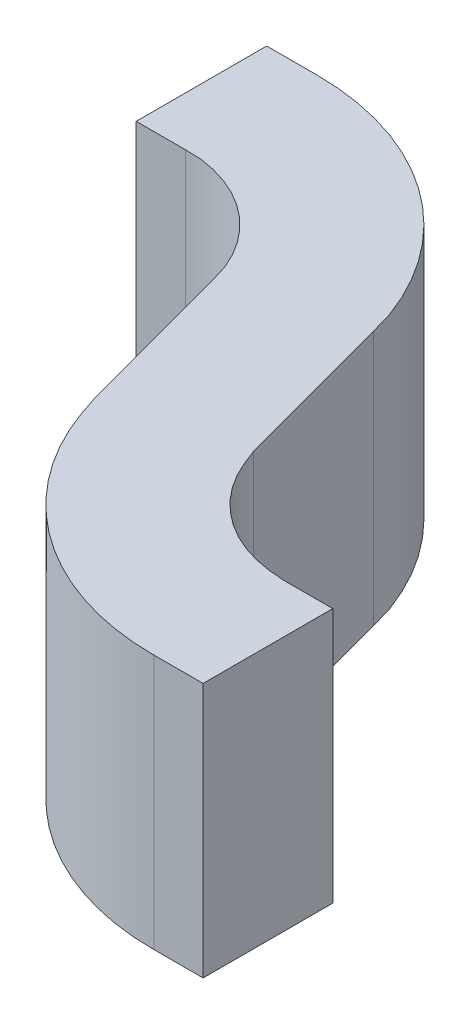
ISO-10303-21;
HEADER;
FILE_DESCRIPTION(('STEP AP214'),'2;1');
FILE_NAME('part.step','',(''),(''),'','','');
FILE_SCHEMA(('AUTOMOTIVE_DESIGN { 1 0 10303 214 1 1 1 1 }'));
ENDSEC;
DATA;
#1=APPLICATION_CONTEXT('core data for automotive mechanical design processes');
#2=APPLICATION_PROTOCOL_DEFINITION('international standard','automotive_design',2000,#1);
#3=PRODUCT_CONTEXT('',#1,'mechanical');
#4=PRODUCT('Part','Part','',(#3));
#5=PRODUCT_RELATED_PRODUCT_CATEGORY('part','',(#4));
#6=PRODUCT_DEFINITION_FORMATION('','',#4);
#7=PRODUCT_DEFINITION_CONTEXT('part definition',#1,'design');
#8=PRODUCT_DEFINITION('design','',#6,#7);
#9=PRODUCT_DEFINITION_SHAPE('','',#8);
#10=(LENGTH_UNIT() NAMED_UNIT(*) SI_UNIT(.MILLI.,.METRE.));
#11=(NAMED_UNIT(*) PLANE_ANGLE_UNIT() SI_UNIT($,.RADIAN.));
#12=(NAMED_UNIT(*) SI_UNIT($,.STERADIAN.) SOLID_ANGLE_UNIT());
#13=UNCERTAINTY_MEASURE_WITH_UNIT(LENGTH_MEASURE(1.E-05),#10,'distance_accuracy_value','');
#14=(GEOMETRIC_REPRESENTATION_CONTEXT(3) GLOBAL_UNCERTAINTY_ASSIGNED_CONTEXT((#13)) GLOBAL_UNIT_ASSIGNED_CONTEXT((#10,
#11,#12)) REPRESENTATION_CONTEXT('',''));
#15=CARTESIAN_POINT('',(0.,0.,0.));
#16=DIRECTION('',(0.,0.,1.));
#17=DIRECTION('',(1.,0.,0.));
#18=AXIS2_PLACEMENT_3D('',#15,#16,#17);
#19=CARTESIAN_POINT('',(-1.054,0.848,0.543));
#20=DIRECTION('',(1.,0.,0.));
#21=DIRECTION('',(0.,0.,1.));
#22=AXIS2_PLACEMENT_3D('',#19,#20,#21);
#23=PLANE('',#22);
#24=DIRECTION('',(0.,-1.,0.));
#25=VECTOR('',#24,1.);
#26=CARTESIAN_POINT('',(-1.054,1.153,0.543));
#27=LINE('',#26,#25);
#28=CARTESIAN_POINT('',(-1.054,1.153,0.543));
#29=VERTEX_POINT('',#28);
#30=CARTESIAN_POINT('',(-1.054,0.848,0.543));
#31=VERTEX_POINT('',#30);
#32=EDGE_CURVE('E11',#29,#31,#27,.T.);
#33=ORIENTED_EDGE('',*,*,#32,.F.);
#34=DIRECTION('',(0.,0.,-1.));
#35=VECTOR('',#34,1.);
#36=CARTESIAN_POINT('',(-1.054,1.153,0.698));
#37=LINE('',#36,#35);
#38=CARTESIAN_POINT('',(-1.054,1.153,0.698));
#39=VERTEX_POINT('',#38);
#40=EDGE_CURVE('E24',#39,#29,#37,.T.);
#41=ORIENTED_EDGE('',*,*,#40,.F.);
#42=DIRECTION('',(0.,1.,0.));
#43=VECTOR('',#42,1.);
#44=CARTESIAN_POINT('',(-1.054,0.848,0.698));
#45=LINE('',#44,#43);
#46=CARTESIAN_POINT('',(-1.054,0.848,0.698));
#47=VERTEX_POINT('',#46);
#48=EDGE_CURVE('E439',#47,#39,#45,.T.);
#49=ORIENTED_EDGE('',*,*,#48,.F.);
#50=DIRECTION('',(0.,0.,1.));
#51=VECTOR('',#50,1.);
#52=CARTESIAN_POINT('',(-1.054,0.848,0.543));
#53=LINE('',#52,#51);
#54=EDGE_CURVE('E437',#31,#47,#53,.T.);
#55=ORIENTED_EDGE('',*,*,#54,.F.);
#56=EDGE_LOOP('',(#33,#41,#49,#55));
#57=FACE_BOUND('',#56,.T.);
#58=ADVANCED_FACE('F17',(#57),#23,.T.);
#59=CARTESIAN_POINT('',(-1.054,0.848,0.698));
#60=DIRECTION('',(0.,0.,1.));
#61=DIRECTION('',(0.,1.,0.));
#62=AXIS2_PLACEMENT_3D('',#59,#60,#61);
#63=PLANE('',#62);
#64=ORIENTED_EDGE('',*,*,#48,.T.);
#65=DIRECTION('',(1.,0.,0.));
#66=VECTOR('',#65,1.);
#67=CARTESIAN_POINT('',(-1.113,1.153,0.698));
#68=LINE('',#67,#66);
#69=CARTESIAN_POINT('',(-1.113,1.153,0.698));
#70=VERTEX_POINT('',#69);
#71=EDGE_CURVE('E435',#70,#39,#68,.T.);
#72=ORIENTED_EDGE('',*,*,#71,.F.);
#73=CARTESIAN_POINT('',(-1.113,0.848,0.69815));
#74=DIRECTION('',(0.,1.,0.));
#75=VECTOR('',#74,1.);
#76=LINE('',#73,#75);
#77=CARTESIAN_POINT('',(-1.113,0.848,0.698));
#78=VERTEX_POINT('',#77);
#79=EDGE_CURVE('E257',#78,#70,#76,.T.);
#80=ORIENTED_EDGE('',*,*,#79,.F.);
#81=DIRECTION('',(-1.,0.,0.));
#82=VECTOR('',#81,1.);
#83=CARTESIAN_POINT('',(-1.054,0.848,0.698));
#84=LINE('',#83,#82);
#85=EDGE_CURVE('E247',#47,#78,#84,.T.);
#86=ORIENTED_EDGE('',*,*,#85,.F.);
#87=EDGE_LOOP('',(#64,#72,#80,#86));
#88=FACE_BOUND('',#87,.T.);
#89=ADVANCED_FACE('F237',(#88),#63,.T.);
#90=CARTESIAN_POINT('',(-1.054,1.153,0.543));
#91=DIRECTION('',(0.,0.,-1.));
#92=DIRECTION('',(0.,1.,0.));
#93=AXIS2_PLACEMENT_3D('',#90,#91,#92);
#94=PLANE('',#93);
#95=ORIENTED_EDGE('',*,*,#32,.T.);
#96=DIRECTION('',(1.,0.,0.));
#97=VECTOR('',#96,1.);
#98=CARTESIAN_POINT('',(-1.113,0.848,0.543));
#99=LINE('',#98,#97);
#100=CARTESIAN_POINT('',(-1.113,0.848,0.543));
#101=VERTEX_POINT('',#100);
#102=EDGE_CURVE('E443',#101,#31,#99,.T.);
#103=ORIENTED_EDGE('',*,*,#102,.F.);
#104=CARTESIAN_POINT('',(-1.113,1.153,0.542575));
#105=DIRECTION('',(0.,-1.,0.));
#106=VECTOR('',#105,1.);
#107=LINE('',#104,#106);
#108=CARTESIAN_POINT('',(-1.113,1.153,0.543));
#109=VERTEX_POINT('',#108);
#110=EDGE_CURVE('E222',#109,#101,#107,.T.);
#111=ORIENTED_EDGE('',*,*,#110,.F.);
#112=DIRECTION('',(-1.,0.,0.));
#113=VECTOR('',#112,1.);
#114=CARTESIAN_POINT('',(-1.054,1.153,0.543));
#115=LINE('',#114,#113);
#116=EDGE_CURVE('E219',#29,#109,#115,.T.);
#117=ORIENTED_EDGE('',*,*,#116,.F.);
#118=EDGE_LOOP('',(#95,#103,#111,#117));
#119=FACE_BOUND('',#118,.T.);
#120=ADVANCED_FACE('F228',(#119),#94,.T.);
#121=CARTESIAN_POINT('',(-1.467,1.153,0.271));
#122=DIRECTION('',(-0.965885549343203,0.,0.258969313954337));
#123=DIRECTION('',(0.258969313954337,0.,0.965885549343203));
#124=AXIS2_PLACEMENT_3D('',#121,#122,#123);
#125=PLANE('',#124);
#126=CARTESIAN_POINT('',(-1.46667799927154,0.848,0.270914133139076));
#127=DIRECTION('',(0.,1.,0.));
#128=VECTOR('',#127,1.);
#129=LINE('',#126,#128);
#130=CARTESIAN_POINT('',(-1.467,0.848,0.271));
#131=VERTEX_POINT('',#130);
#132=CARTESIAN_POINT('',(-1.467,1.153,0.271));
#133=VERTEX_POINT('',#132);
#134=EDGE_CURVE('E215',#131,#133,#129,.T.);
#135=ORIENTED_EDGE('',*,*,#134,.F.);
#136=CARTESIAN_POINT('',(-1.414,0.848,0.468));
#137=DIRECTION('',(-0.258969313954337,0.,-0.965885549343202));
#138=VECTOR('',#137,1.);
#139=LINE('',#136,#138);
#140=CARTESIAN_POINT('',(-1.414,0.848,0.468));
#141=VERTEX_POINT('',#140);
#142=EDGE_CURVE('E301',#141,#131,#139,.T.);
#143=ORIENTED_EDGE('',*,*,#142,.F.);
#144=CARTESIAN_POINT('',(-1.41346097901335,1.153,0.467854947840802));
#145=DIRECTION('',(0.,-1.,0.));
#146=VECTOR('',#145,1.);
#147=LINE('',#144,#146);
#148=CARTESIAN_POINT('',(-1.414,1.153,0.468));
#149=VERTEX_POINT('',#148);
#150=EDGE_CURVE('E288',#149,#141,#147,.T.);
#151=ORIENTED_EDGE('',*,*,#150,.F.);
#152=DIRECTION('',(0.258969313954337,0.,0.965885549343203));
#153=VECTOR('',#152,1.);
#154=CARTESIAN_POINT('',(-1.467,1.153,0.271));
#155=LINE('',#154,#153);
#156=EDGE_CURVE('E356',#133,#149,#155,.T.);
#157=ORIENTED_EDGE('',*,*,#156,.F.);
#158=EDGE_LOOP('',(#135,#143,#151,#157));
#159=FACE_BOUND('',#158,.T.);
#160=ADVANCED_FACE('F236',(#159),#125,.T.);
#161=CARTESIAN_POINT('',(-1.317,0.848,0.231));
#162=DIRECTION('',(0.965885549343203,0.,-0.258969313954337));
#163=DIRECTION('',(0.258969313954337,0.,0.965885549343203));
#164=AXIS2_PLACEMENT_3D('',#161,#162,#163);
#165=PLANE('',#164);
#166=CARTESIAN_POINT('',(-1.31635599854307,1.153,0.230828266278153));
#167=DIRECTION('',(0.,-1.,0.));
#168=VECTOR('',#167,1.);
#169=LINE('',#166,#168);
#170=CARTESIAN_POINT('',(-1.317,1.153,0.231));
#171=VERTEX_POINT('',#170);
#172=CARTESIAN_POINT('',(-1.317,0.848,0.231));
#173=VERTEX_POINT('',#172);
#174=EDGE_CURVE('E342',#171,#173,#169,.T.);
#175=ORIENTED_EDGE('',*,*,#174,.F.);
#176=CARTESIAN_POINT('',(-1.264,1.153,0.428));
#177=DIRECTION('',(-0.258969313954337,0.,-0.965885549343202));
#178=VECTOR('',#177,1.);
#179=LINE('',#176,#178);
#180=CARTESIAN_POINT('',(-1.264,1.153,0.428));
#181=VERTEX_POINT('',#180);
#182=EDGE_CURVE('E330',#181,#171,#179,.T.);
#183=ORIENTED_EDGE('',*,*,#182,.F.);
#184=CARTESIAN_POINT('',(-1.2631389278252,0.848,0.427766198945916));
#185=DIRECTION('',(0.,1.,0.));
#186=VECTOR('',#185,1.);
#187=LINE('',#184,#186);
#188=CARTESIAN_POINT('',(-1.264,0.848,0.428));
#189=VERTEX_POINT('',#188);
#190=EDGE_CURVE('E366',#189,#181,#187,.T.);
#191=ORIENTED_EDGE('',*,*,#190,.F.);
#192=DIRECTION('',(0.258969313954337,0.,0.965885549343203));
#193=VECTOR('',#192,1.);
#194=CARTESIAN_POINT('',(-1.317,0.848,0.231));
#195=LINE('',#194,#193);
#196=EDGE_CURVE('E368',#173,#189,#195,.T.);
#197=ORIENTED_EDGE('',*,*,#196,.F.);
#198=EDGE_LOOP('',(#175,#183,#191,#197));
#199=FACE_BOUND('',#198,.T.);
#200=ADVANCED_FACE('F160',(#199),#165,.T.);
#201=CARTESIAN_POINT('',(-1.676,1.153,0.156));
#202=DIRECTION('',(0.,0.,1.));
#203=DIRECTION('',(0.,1.,0.));
#204=AXIS2_PLACEMENT_3D('',#201,#202,#203);
#205=PLANE('',#204);
#206=DIRECTION('',(0.,1.,0.));
#207=VECTOR('',#206,1.);
#208=CARTESIAN_POINT('',(-1.676,0.848,0.156));
#209=LINE('',#208,#207);
#210=CARTESIAN_POINT('',(-1.676,0.848,0.156));
#211=VERTEX_POINT('',#210);
#212=CARTESIAN_POINT('',(-1.676,1.153,0.156));
#213=VERTEX_POINT('',#212);
#214=EDGE_CURVE('E125',#211,#213,#209,.T.);
#215=ORIENTED_EDGE('',*,*,#214,.F.);
#216=DIRECTION('',(-1.,0.,0.));
#217=VECTOR('',#216,1.);
#218=CARTESIAN_POINT('',(-1.617,0.848,0.156));
#219=LINE('',#218,#217);
#220=CARTESIAN_POINT('',(-1.617,0.848,0.156));
#221=VERTEX_POINT('',#220);
#222=EDGE_CURVE('E377',#221,#211,#219,.T.);
#223=ORIENTED_EDGE('',*,*,#222,.F.);
#224=CARTESIAN_POINT('',(-1.617,1.153,0.155425));
#225=DIRECTION('',(0.,-1.,0.));
#226=VECTOR('',#225,1.);
#227=LINE('',#224,#226);
#228=CARTESIAN_POINT('',(-1.617,1.153,0.156));
#229=VERTEX_POINT('',#228);
#230=EDGE_CURVE('E178',#229,#221,#227,.T.);
#231=ORIENTED_EDGE('',*,*,#230,.F.);
#232=DIRECTION('',(1.,0.,0.));
#233=VECTOR('',#232,1.);
#234=CARTESIAN_POINT('',(-1.676,1.153,0.156));
#235=LINE('',#234,#233);
#236=EDGE_CURVE('E169',#213,#229,#235,.T.);
#237=ORIENTED_EDGE('',*,*,#236,.F.);
#238=EDGE_LOOP('',(#215,#223,#231,#237));
#239=FACE_BOUND('',#238,.T.);
#240=ADVANCED_FACE('F155',(#239),#205,.T.);
#241=CARTESIAN_POINT('',(-1.617,1.153,0.));
#242=DIRECTION('',(0.,0.,-1.));
#243=DIRECTION('',(0.,1.,0.));
#244=AXIS2_PLACEMENT_3D('',#241,#242,#243);
#245=PLANE('',#244);
#246=CARTESIAN_POINT('',(-1.617,0.848,-0.000149999999999977));
#247=DIRECTION('',(0.,1.,0.));
#248=VECTOR('',#247,1.);
#249=LINE('',#246,#248);
#250=CARTESIAN_POINT('',(-1.617,0.848,0.));
#251=VERTEX_POINT('',#250);
#252=CARTESIAN_POINT('',(-1.617,1.153,0.));
#253=VERTEX_POINT('',#252);
#254=EDGE_CURVE('E140',#251,#253,#249,.T.);
#255=ORIENTED_EDGE('',*,*,#254,.F.);
#256=DIRECTION('',(1.,0.,0.));
#257=VECTOR('',#256,1.);
#258=CARTESIAN_POINT('',(-1.676,0.848,0.));
#259=LINE('',#258,#257);
#260=CARTESIAN_POINT('',(-1.676,0.848,0.));
#261=VERTEX_POINT('',#260);
#262=EDGE_CURVE('E107',#261,#251,#259,.T.);
#263=ORIENTED_EDGE('',*,*,#262,.F.);
#264=DIRECTION('',(0.,-1.,0.));
#265=VECTOR('',#264,1.);
#266=CARTESIAN_POINT('',(-1.676,1.153,0.));
#267=LINE('',#266,#265);
#268=CARTESIAN_POINT('',(-1.676,1.153,0.));
#269=VERTEX_POINT('',#268);
#270=EDGE_CURVE('E101',#269,#261,#267,.T.);
#271=ORIENTED_EDGE('',*,*,#270,.F.);
#272=DIRECTION('',(-1.,0.,0.));
#273=VECTOR('',#272,1.);
#274=CARTESIAN_POINT('',(-1.617,1.153,0.));
#275=LINE('',#274,#273);
#276=EDGE_CURVE('E104',#253,#269,#275,.T.);
#277=ORIENTED_EDGE('',*,*,#276,.F.);
#278=EDGE_LOOP('',(#255,#263,#271,#277));
#279=FACE_BOUND('',#278,.T.);
#280=ADVANCED_FACE('F103',(#279),#245,.T.);
#281=CARTESIAN_POINT('',(-1.676,1.153,0.));
#282=DIRECTION('',(-1.,0.,0.));
#283=DIRECTION('',(0.,0.,1.));
#284=AXIS2_PLACEMENT_3D('',#281,#282,#283);
#285=PLANE('',#284);
#286=ORIENTED_EDGE('',*,*,#270,.T.);
#287=DIRECTION('',(0.,0.,-1.));
#288=VECTOR('',#287,1.);
#289=CARTESIAN_POINT('',(-1.676,0.848,0.156));
#290=LINE('',#289,#288);
#291=EDGE_CURVE('E122',#211,#261,#290,.T.);
#292=ORIENTED_EDGE('',*,*,#291,.F.);
#293=ORIENTED_EDGE('',*,*,#214,.T.);
#294=DIRECTION('',(0.,0.,1.));
#295=VECTOR('',#294,1.);
#296=CARTESIAN_POINT('',(-1.676,1.153,0.));
#297=LINE('',#296,#295);
#298=EDGE_CURVE('E118',#269,#213,#297,.T.);
#299=ORIENTED_EDGE('',*,*,#298,.F.);
#300=EDGE_LOOP('',(#286,#292,#293,#299));
#301=FACE_BOUND('',#300,.T.);
#302=ADVANCED_FACE('F124',(#301),#285,.T.);
#303=CARTESIAN_POINT('',(-1.113,0.848,0.387));
#304=DIRECTION('',(0.,-1.,0.));
#305=DIRECTION('',(0.,0.,1.));
#306=AXIS2_PLACEMENT_3D('',#303,#304,#305);
#307=CYLINDRICAL_SURFACE('',#306,0.31115);
#308=ORIENTED_EDGE('',*,*,#79,.T.);
#309=CARTESIAN_POINT('',(-1.113,1.153,0.387));
#310=DIRECTION('',(0.,1.,0.));
#311=DIRECTION('',(0.793107076683516,0.,0.609082231652284));
#312=AXIS2_PLACEMENT_3D('',#309,#310,#311);
#313=CIRCLE('',#312,0.31115);
#314=EDGE_CURVE('E127',#149,#70,#313,.T.);
#315=ORIENTED_EDGE('',*,*,#314,.F.);
#316=ORIENTED_EDGE('',*,*,#150,.T.);
#317=CARTESIAN_POINT('',(-1.113,0.848,0.387));
#318=DIRECTION('',(0.,-1.,0.));
#319=DIRECTION('',(-0.793107076683516,0.,-0.609082231652284));
#320=AXIS2_PLACEMENT_3D('',#317,#318,#319);
#321=CIRCLE('',#320,0.31115);
#322=EDGE_CURVE('E131',#78,#141,#321,.T.);
#323=ORIENTED_EDGE('',*,*,#322,.F.);
#324=EDGE_LOOP('',(#308,#315,#316,#323));
#325=FACE_BOUND('',#324,.T.);
#326=ADVANCED_FACE('F263',(#325),#307,.T.);
#327=CARTESIAN_POINT('',(-1.113,1.153,0.387));
#328=DIRECTION('',(0.,-1.,0.));
#329=DIRECTION('',(0.,0.,-1.));
#330=AXIS2_PLACEMENT_3D('',#327,#328,#329);
#331=CYLINDRICAL_SURFACE('',#330,0.155575);
#332=ORIENTED_EDGE('',*,*,#110,.T.);
#333=CARTESIAN_POINT('',(-1.113,0.848,0.387));
#334=DIRECTION('',(0.,1.,0.));
#335=DIRECTION('',(0.793107076683516,0.,0.609082231652284));
#336=AXIS2_PLACEMENT_3D('',#333,#334,#335);
#337=CIRCLE('',#336,0.155575);
#338=EDGE_CURVE('E427',#189,#101,#337,.T.);
#339=ORIENTED_EDGE('',*,*,#338,.F.);
#340=ORIENTED_EDGE('',*,*,#190,.T.);
#341=CARTESIAN_POINT('',(-1.113,1.153,0.387));
#342=DIRECTION('',(0.,-1.,0.));
#343=DIRECTION('',(-0.793107076683516,0.,-0.609082231652284));
#344=AXIS2_PLACEMENT_3D('',#341,#342,#343);
#345=CIRCLE('',#344,0.155575);
#346=EDGE_CURVE('E423',#109,#181,#345,.T.);
#347=ORIENTED_EDGE('',*,*,#346,.F.);
#348=EDGE_LOOP('',(#332,#339,#340,#347));
#349=FACE_BOUND('',#348,.T.);
#350=ADVANCED_FACE('F195',(#349),#331,.F.);
#351=CARTESIAN_POINT('',(-1.617,1.153,0.311));
#352=DIRECTION('',(0.,-1.,0.));
#353=DIRECTION('',(0.,0.,1.));
#354=AXIS2_PLACEMENT_3D('',#351,#352,#353);
#355=CYLINDRICAL_SURFACE('',#354,0.155575);
#356=ORIENTED_EDGE('',*,*,#230,.T.);
#357=CARTESIAN_POINT('',(-1.617,0.848,0.311));
#358=DIRECTION('',(0.,1.,0.));
#359=DIRECTION('',(-0.793107076683516,0.,-0.609082231652284));
#360=AXIS2_PLACEMENT_3D('',#357,#358,#359);
#361=CIRCLE('',#360,0.155575);
#362=EDGE_CURVE('E418',#131,#221,#361,.T.);
#363=ORIENTED_EDGE('',*,*,#362,.F.);
#364=ORIENTED_EDGE('',*,*,#134,.T.);
#365=CARTESIAN_POINT('',(-1.617,1.153,0.311));
#366=DIRECTION('',(0.,-1.,0.));
#367=DIRECTION('',(0.793107076683516,0.,0.609082231652284));
#368=AXIS2_PLACEMENT_3D('',#365,#366,#367);
#369=CIRCLE('',#368,0.155575);
#370=EDGE_CURVE('E408',#229,#133,#369,.T.);
#371=ORIENTED_EDGE('',*,*,#370,.F.);
#372=EDGE_LOOP('',(#356,#363,#364,#371));
#373=FACE_BOUND('',#372,.T.);
#374=ADVANCED_FACE('F184',(#373),#355,.F.);
#375=CARTESIAN_POINT('',(-1.617,1.153,0.311));
#376=DIRECTION('',(0.,-1.,0.));
#377=DIRECTION('',(0.,0.,-1.));
#378=AXIS2_PLACEMENT_3D('',#375,#376,#377);
#379=CYLINDRICAL_SURFACE('',#378,0.31115);
#380=ORIENTED_EDGE('',*,*,#254,.T.);
#381=CARTESIAN_POINT('',(-1.617,1.153,0.311));
#382=DIRECTION('',(0.,1.,0.));
#383=DIRECTION('',(-0.793107076683516,0.,-0.609082231652284));
#384=AXIS2_PLACEMENT_3D('',#381,#382,#383);
#385=CIRCLE('',#384,0.31115);
#386=EDGE_CURVE('E121',#171,#253,#385,.T.);
#387=ORIENTED_EDGE('',*,*,#386,.F.);
#388=ORIENTED_EDGE('',*,*,#174,.T.);
#389=CARTESIAN_POINT('',(-1.617,0.848,0.311));
#390=DIRECTION('',(0.,-1.,0.));
#391=DIRECTION('',(0.793107076683516,0.,0.609082231652284));
#392=AXIS2_PLACEMENT_3D('',#389,#390,#391);
#393=CIRCLE('',#392,0.31115);
#394=EDGE_CURVE('E405',#251,#173,#393,.T.);
#395=ORIENTED_EDGE('',*,*,#394,.F.);
#396=EDGE_LOOP('',(#380,#387,#388,#395));
#397=FACE_BOUND('',#396,.T.);
#398=ADVANCED_FACE('F194',(#397),#379,.T.);
#399=CARTESIAN_POINT('',(-1.054,1.153,0.543));
#400=DIRECTION('',(0.,1.,0.));
#401=DIRECTION('',(1.,0.,0.));
#402=AXIS2_PLACEMENT_3D('',#399,#400,#401);
#403=PLANE('',#402);
#404=ORIENTED_EDGE('',*,*,#71,.T.);
#405=ORIENTED_EDGE('',*,*,#40,.T.);
#406=ORIENTED_EDGE('',*,*,#116,.T.);
#407=ORIENTED_EDGE('',*,*,#346,.T.);
#408=ORIENTED_EDGE('',*,*,#182,.T.);
#409=ORIENTED_EDGE('',*,*,#386,.T.);
#410=ORIENTED_EDGE('',*,*,#276,.T.);
#411=ORIENTED_EDGE('',*,*,#298,.T.);
#412=ORIENTED_EDGE('',*,*,#236,.T.);
#413=ORIENTED_EDGE('',*,*,#370,.T.);
#414=ORIENTED_EDGE('',*,*,#156,.T.);
#415=ORIENTED_EDGE('',*,*,#314,.T.);
#416=EDGE_LOOP('',(#404,#405,#406,#407,#408,#409,#410,#411,#412,#413,#414,#415));
#417=FACE_BOUND('',#416,.T.);
#418=ADVANCED_FACE('F116',(#417),#403,.T.);
#419=CARTESIAN_POINT('',(-1.617,0.848,0.156));
#420=DIRECTION('',(0.,-1.,0.));
#421=DIRECTION('',(1.,0.,0.));
#422=AXIS2_PLACEMENT_3D('',#419,#420,#421);
#423=PLANE('',#422);
#424=ORIENTED_EDGE('',*,*,#102,.T.);
#425=ORIENTED_EDGE('',*,*,#54,.T.);
#426=ORIENTED_EDGE('',*,*,#85,.T.);
#427=ORIENTED_EDGE('',*,*,#322,.T.);
#428=ORIENTED_EDGE('',*,*,#142,.T.);
#429=ORIENTED_EDGE('',*,*,#362,.T.);
#430=ORIENTED_EDGE('',*,*,#222,.T.);
#431=ORIENTED_EDGE('',*,*,#291,.T.);
#432=ORIENTED_EDGE('',*,*,#262,.T.);
#433=ORIENTED_EDGE('',*,*,#394,.T.);
#434=ORIENTED_EDGE('',*,*,#196,.T.);
#435=ORIENTED_EDGE('',*,*,#338,.T.);
#436=EDGE_LOOP('',(#424,#425,#426,#427,#428,#429,#430,#431,#432,#433,#434,#435));
#437=FACE_BOUND('',#436,.T.);
#438=ADVANCED_FACE('F306',(#437),#423,.T.);
#439=CLOSED_SHELL('',(#58,#89,#120,#160,#200,#240,#280,#302,#326,#350,#374,#398,#418,#438));
#440=MANIFOLD_SOLID_BREP('B1',#439);
#441=ADVANCED_BREP_SHAPE_REPRESENTATION('',(#18,#440),#14);
#442=SHAPE_DEFINITION_REPRESENTATION(#9,#441);
ENDSEC;
END-ISO-10303-21;
